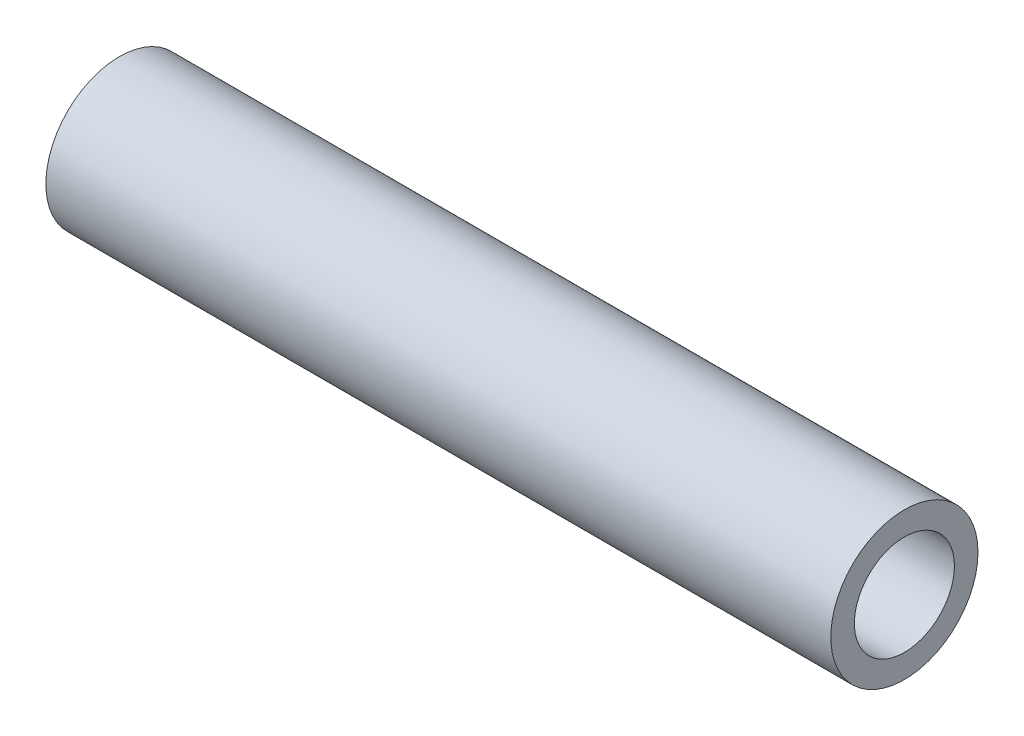
ISO-10303-21;
HEADER;
FILE_DESCRIPTION(('STEP AP214'),'2;1');
FILE_NAME('part.step','',(''),(''),'','','');
FILE_SCHEMA(('AUTOMOTIVE_DESIGN { 1 0 10303 214 1 1 1 1 }'));
ENDSEC;
DATA;
#1=APPLICATION_CONTEXT('core data for automotive mechanical design processes');
#2=APPLICATION_PROTOCOL_DEFINITION('international standard','automotive_design',2000,#1);
#3=PRODUCT_CONTEXT('',#1,'mechanical');
#4=PRODUCT('Part','Part','',(#3));
#5=PRODUCT_RELATED_PRODUCT_CATEGORY('part','',(#4));
#6=PRODUCT_DEFINITION_FORMATION('','',#4);
#7=PRODUCT_DEFINITION_CONTEXT('part definition',#1,'design');
#8=PRODUCT_DEFINITION('design','',#6,#7);
#9=PRODUCT_DEFINITION_SHAPE('','',#8);
#10=(LENGTH_UNIT() NAMED_UNIT(*) SI_UNIT(.MILLI.,.METRE.));
#11=(NAMED_UNIT(*) PLANE_ANGLE_UNIT() SI_UNIT($,.RADIAN.));
#12=(NAMED_UNIT(*) SI_UNIT($,.STERADIAN.) SOLID_ANGLE_UNIT());
#13=UNCERTAINTY_MEASURE_WITH_UNIT(LENGTH_MEASURE(1.E-05),#10,'distance_accuracy_value','');
#14=(GEOMETRIC_REPRESENTATION_CONTEXT(3) GLOBAL_UNCERTAINTY_ASSIGNED_CONTEXT((#13)) GLOBAL_UNIT_ASSIGNED_CONTEXT((#10,
#11,#12)) REPRESENTATION_CONTEXT('',''));
#15=CARTESIAN_POINT('',(0.,0.,0.));
#16=DIRECTION('',(0.,0.,1.));
#17=DIRECTION('',(1.,0.,0.));
#18=AXIS2_PLACEMENT_3D('',#15,#16,#17);
#19=CARTESIAN_POINT('',(0.,0.,0.));
#20=DIRECTION('',(1.,0.,0.));
#21=DIRECTION('',(0.,0.,-1.));
#22=AXIS2_PLACEMENT_3D('',#19,#20,#21);
#23=CYLINDRICAL_SURFACE('',#22,6.477);
#24=CARTESIAN_POINT('',(101.6,0.,0.));
#25=DIRECTION('',(1.,0.,0.));
#26=DIRECTION('',(0.,0.,-1.));
#27=AXIS2_PLACEMENT_3D('',#24,#25,#26);
#28=CIRCLE('',#27,6.477);
#29=CARTESIAN_POINT('',(101.6,0.,-6.477));
#30=VERTEX_POINT('',#29);
#31=EDGE_CURVE('E17',#30,#30,#28,.F.);
#32=ORIENTED_EDGE('',*,*,#31,.F.);
#33=EDGE_LOOP('',(#32));
#34=FACE_BOUND('',#33,.T.);
#35=CARTESIAN_POINT('',(0.,0.,0.));
#36=DIRECTION('',(1.,0.,0.));
#37=DIRECTION('',(0.,0.,-1.));
#38=AXIS2_PLACEMENT_3D('',#35,#36,#37);
#39=CIRCLE('',#38,6.477);
#40=CARTESIAN_POINT('',(0.,0.,-6.477));
#41=VERTEX_POINT('',#40);
#42=EDGE_CURVE('E26',#41,#41,#39,.F.);
#43=ORIENTED_EDGE('',*,*,#42,.T.);
#44=EDGE_LOOP('',(#43));
#45=FACE_BOUND('',#44,.T.);
#46=ADVANCED_FACE('F14',(#34,#45),#23,.F.);
#47=CARTESIAN_POINT('',(101.6,0.,0.));
#48=DIRECTION('',(1.,0.,0.));
#49=DIRECTION('',(0.,0.,-1.));
#50=AXIS2_PLACEMENT_3D('',#47,#48,#49);
#51=PLANE('',#50);
#52=ORIENTED_EDGE('',*,*,#31,.T.);
#53=EDGE_LOOP('',(#52));
#54=FACE_BOUND('',#53,.T.);
#55=CARTESIAN_POINT('',(101.6,0.,0.));
#56=DIRECTION('',(1.,0.,0.));
#57=DIRECTION('',(0.,0.,-1.));
#58=AXIS2_PLACEMENT_3D('',#55,#56,#57);
#59=CIRCLE('',#58,9.525);
#60=CARTESIAN_POINT('',(101.6,0.,-9.525));
#61=VERTEX_POINT('',#60);
#62=EDGE_CURVE('E21',#61,#61,#59,.F.);
#63=ORIENTED_EDGE('',*,*,#62,.F.);
#64=EDGE_LOOP('',(#63));
#65=FACE_BOUND('',#64,.T.);
#66=ADVANCED_FACE('F34',(#54,#65),#51,.T.);
#67=CARTESIAN_POINT('',(0.,0.,0.));
#68=DIRECTION('',(1.,0.,0.));
#69=DIRECTION('',(0.,0.,-1.));
#70=AXIS2_PLACEMENT_3D('',#67,#68,#69);
#71=PLANE('',#70);
#72=ORIENTED_EDGE('',*,*,#42,.F.);
#73=EDGE_LOOP('',(#72));
#74=FACE_BOUND('',#73,.T.);
#75=CARTESIAN_POINT('',(0.,0.,0.));
#76=DIRECTION('',(1.,0.,0.));
#77=DIRECTION('',(0.,0.,-1.));
#78=AXIS2_PLACEMENT_3D('',#75,#76,#77);
#79=CIRCLE('',#78,9.525);
#80=CARTESIAN_POINT('',(0.,0.,-9.525));
#81=VERTEX_POINT('',#80);
#82=EDGE_CURVE('E10',#81,#81,#79,.T.);
#83=ORIENTED_EDGE('',*,*,#82,.F.);
#84=EDGE_LOOP('',(#83));
#85=FACE_BOUND('',#84,.T.);
#86=ADVANCED_FACE('F42',(#74,#85),#71,.F.);
#87=CARTESIAN_POINT('',(0.,0.,0.));
#88=DIRECTION('',(1.,0.,0.));
#89=DIRECTION('',(0.,0.,-1.));
#90=AXIS2_PLACEMENT_3D('',#87,#88,#89);
#91=CYLINDRICAL_SURFACE('',#90,9.525);
#92=ORIENTED_EDGE('',*,*,#62,.T.);
#93=EDGE_LOOP('',(#92));
#94=FACE_BOUND('',#93,.T.);
#95=ORIENTED_EDGE('',*,*,#82,.T.);
#96=EDGE_LOOP('',(#95));
#97=FACE_BOUND('',#96,.T.);
#98=ADVANCED_FACE('F43',(#94,#97),#91,.T.);
#99=CLOSED_SHELL('',(#46,#66,#86,#98));
#100=MANIFOLD_SOLID_BREP('B1',#99);
#101=ADVANCED_BREP_SHAPE_REPRESENTATION('',(#18,#100),#14);
#102=SHAPE_DEFINITION_REPRESENTATION(#9,#101);
ENDSEC;
END-ISO-10303-21;
